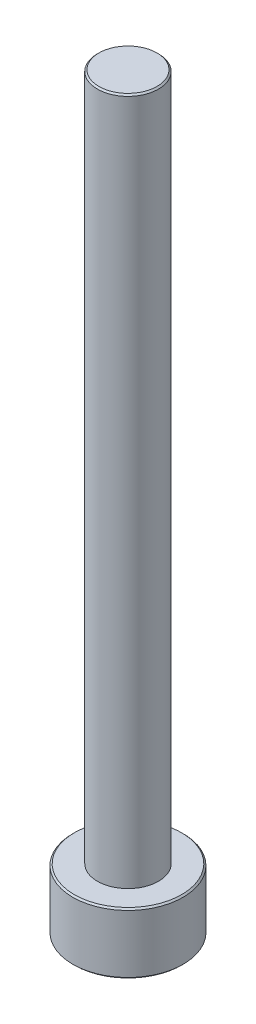
ISO-10303-21;
HEADER;
FILE_DESCRIPTION(('STEP AP214'),'2;1');
FILE_NAME('part.step','',(''),(''),'','','');
FILE_SCHEMA(('AUTOMOTIVE_DESIGN { 1 0 10303 214 1 1 1 1 }'));
ENDSEC;
DATA;
#1=APPLICATION_CONTEXT('core data for automotive mechanical design processes');
#2=APPLICATION_PROTOCOL_DEFINITION('international standard','automotive_design',2000,#1);
#3=PRODUCT_CONTEXT('',#1,'mechanical');
#4=PRODUCT('Part','Part','',(#3));
#5=PRODUCT_RELATED_PRODUCT_CATEGORY('part','',(#4));
#6=PRODUCT_DEFINITION_FORMATION('','',#4);
#7=PRODUCT_DEFINITION_CONTEXT('part definition',#1,'design');
#8=PRODUCT_DEFINITION('design','',#6,#7);
#9=PRODUCT_DEFINITION_SHAPE('','',#8);
#10=(LENGTH_UNIT() NAMED_UNIT(*) SI_UNIT(.MILLI.,.METRE.));
#11=(NAMED_UNIT(*) PLANE_ANGLE_UNIT() SI_UNIT($,.RADIAN.));
#12=(NAMED_UNIT(*) SI_UNIT($,.STERADIAN.) SOLID_ANGLE_UNIT());
#13=UNCERTAINTY_MEASURE_WITH_UNIT(LENGTH_MEASURE(1.E-05),#10,'distance_accuracy_value','');
#14=(GEOMETRIC_REPRESENTATION_CONTEXT(3) GLOBAL_UNCERTAINTY_ASSIGNED_CONTEXT((#13)) GLOBAL_UNIT_ASSIGNED_CONTEXT((#10,
#11,#12)) REPRESENTATION_CONTEXT('',''));
#15=CARTESIAN_POINT('',(0.,0.,0.));
#16=DIRECTION('',(0.,0.,1.));
#17=DIRECTION('',(1.,0.,0.));
#18=AXIS2_PLACEMENT_3D('',#15,#16,#17);
#19=CARTESIAN_POINT('',(0.,4.,0.));
#20=DIRECTION('',(0.,-1.,0.));
#21=DIRECTION('',(0.,0.,-1.));
#22=AXIS2_PLACEMENT_3D('',#19,#20,#21);
#23=CYLINDRICAL_SURFACE('',#22,3.61);
#24=CARTESIAN_POINT('',(0.,3.89999999999999,0.));
#25=DIRECTION('',(0.,1.,0.));
#26=DIRECTION('',(0.,0.,1.));
#27=AXIS2_PLACEMENT_3D('',#24,#25,#26);
#28=CIRCLE('',#27,3.61);
#29=CARTESIAN_POINT('',(0.,3.89999999999999,3.61));
#30=VERTEX_POINT('',#29);
#31=EDGE_CURVE('E55',#30,#30,#28,.F.);
#32=ORIENTED_EDGE('',*,*,#31,.T.);
#33=EDGE_LOOP('',(#32));
#34=FACE_BOUND('',#33,.T.);
#35=CARTESIAN_POINT('',(0.,0.100000000000002,0.));
#36=DIRECTION('',(0.,1.,0.));
#37=DIRECTION('',(0.,0.,1.));
#38=AXIS2_PLACEMENT_3D('',#35,#36,#37);
#39=CIRCLE('',#38,3.61);
#40=CARTESIAN_POINT('',(0.,0.100000000000002,3.61));
#41=VERTEX_POINT('',#40);
#42=EDGE_CURVE('E166',#41,#41,#39,.T.);
#43=ORIENTED_EDGE('',*,*,#42,.T.);
#44=EDGE_LOOP('',(#43));
#45=FACE_BOUND('',#44,.T.);
#46=ADVANCED_FACE('F47',(#34,#45),#23,.T.);
#47=CARTESIAN_POINT('',(0.,4.,0.));
#48=DIRECTION('',(0.,1.,0.));
#49=DIRECTION('',(0.,0.,1.));
#50=AXIS2_PLACEMENT_3D('',#47,#48,#49);
#51=PLANE('',#50);
#52=CARTESIAN_POINT('',(0.,4.,0.));
#53=DIRECTION('',(0.,1.,0.));
#54=DIRECTION('',(0.,0.,1.));
#55=AXIS2_PLACEMENT_3D('',#52,#53,#54);
#56=CIRCLE('',#55,3.50999999999999);
#57=CARTESIAN_POINT('',(0.,4.,3.50999999999999));
#58=VERTEX_POINT('',#57);
#59=EDGE_CURVE('E163',#58,#58,#56,.T.);
#60=ORIENTED_EDGE('',*,*,#59,.T.);
#61=EDGE_LOOP('',(#60));
#62=FACE_BOUND('',#61,.T.);
#63=CARTESIAN_POINT('',(0.,4.,0.));
#64=DIRECTION('',(0.,1.,0.));
#65=DIRECTION('',(0.,0.,1.));
#66=AXIS2_PLACEMENT_3D('',#63,#64,#65);
#67=CIRCLE('',#66,2.);
#68=CARTESIAN_POINT('',(0.,4.,-2.));
#69=VERTEX_POINT('',#68);
#70=EDGE_CURVE('E149',#69,#69,#67,.T.);
#71=ORIENTED_EDGE('',*,*,#70,.F.);
#72=EDGE_LOOP('',(#71));
#73=FACE_BOUND('',#72,.T.);
#74=ADVANCED_FACE('F179',(#62,#73),#51,.T.);
#75=CARTESIAN_POINT('',(0.,0.,0.));
#76=DIRECTION('',(0.,1.,0.));
#77=DIRECTION('',(0.,0.,1.));
#78=AXIS2_PLACEMENT_3D('',#75,#76,#77);
#79=PLANE('',#78);
#80=CARTESIAN_POINT('',(0.,0.,0.));
#81=DIRECTION('',(0.,1.,0.));
#82=DIRECTION('',(0.,0.,1.));
#83=AXIS2_PLACEMENT_3D('',#80,#81,#82);
#84=CIRCLE('',#83,3.51);
#85=CARTESIAN_POINT('',(0.,0.,3.51));
#86=VERTEX_POINT('',#85);
#87=EDGE_CURVE('E11',#86,#86,#84,.F.);
#88=ORIENTED_EDGE('',*,*,#87,.T.);
#89=EDGE_LOOP('',(#88));
#90=FACE_BOUND('',#89,.T.);
#91=DIRECTION('',(0.,0.,1.));
#92=VECTOR('',#91,1.);
#93=CARTESIAN_POINT('',(1.54,0.,-0.889119414552024));
#94=LINE('',#93,#92);
#95=CARTESIAN_POINT('',(1.54,0.,-0.889119414552024));
#96=VERTEX_POINT('',#95);
#97=CARTESIAN_POINT('',(1.54,0.,0.889119414552024));
#98=VERTEX_POINT('',#97);
#99=EDGE_CURVE('E136',#96,#98,#94,.T.);
#100=ORIENTED_EDGE('',*,*,#99,.F.);
#101=DIRECTION('',(0.866025403784439,0.,0.5));
#102=VECTOR('',#101,1.);
#103=CARTESIAN_POINT('',(0.,0.,-1.77823882910405));
#104=LINE('',#103,#102);
#105=CARTESIAN_POINT('',(0.,0.,-1.77823882910405));
#106=VERTEX_POINT('',#105);
#107=EDGE_CURVE('E62',#106,#96,#104,.T.);
#108=ORIENTED_EDGE('',*,*,#107,.F.);
#109=DIRECTION('',(0.866025403784439,0.,-0.5));
#110=VECTOR('',#109,1.);
#111=CARTESIAN_POINT('',(-1.54,0.,-0.889119414552024));
#112=LINE('',#111,#110);
#113=CARTESIAN_POINT('',(-1.54,0.,-0.889119414552024));
#114=VERTEX_POINT('',#113);
#115=EDGE_CURVE('E145',#114,#106,#112,.T.);
#116=ORIENTED_EDGE('',*,*,#115,.F.);
#117=DIRECTION('',(0.,0.,-1.));
#118=VECTOR('',#117,1.);
#119=CARTESIAN_POINT('',(-1.54,0.,0.889119414552024));
#120=LINE('',#119,#118);
#121=CARTESIAN_POINT('',(-1.54,0.,0.889119414552024));
#122=VERTEX_POINT('',#121);
#123=EDGE_CURVE('E143',#122,#114,#120,.T.);
#124=ORIENTED_EDGE('',*,*,#123,.F.);
#125=DIRECTION('',(-0.866025403784438,0.,-0.5));
#126=VECTOR('',#125,1.);
#127=CARTESIAN_POINT('',(0.,0.,1.77823882910405));
#128=LINE('',#127,#126);
#129=CARTESIAN_POINT('',(0.,0.,1.77823882910405));
#130=VERTEX_POINT('',#129);
#131=EDGE_CURVE('E110',#130,#122,#128,.T.);
#132=ORIENTED_EDGE('',*,*,#131,.F.);
#133=DIRECTION('',(-0.866025403784439,0.,0.5));
#134=VECTOR('',#133,1.);
#135=CARTESIAN_POINT('',(1.54,0.,0.889119414552024));
#136=LINE('',#135,#134);
#137=EDGE_CURVE('E139',#98,#130,#136,.T.);
#138=ORIENTED_EDGE('',*,*,#137,.F.);
#139=EDGE_LOOP('',(#100,#108,#116,#124,#132,#138));
#140=FACE_BOUND('',#139,.T.);
#141=ADVANCED_FACE('F182',(#90,#140),#79,.F.);
#142=CARTESIAN_POINT('',(0.,49.,0.));
#143=DIRECTION('',(0.,-1.,0.));
#144=DIRECTION('',(0.,0.,-1.));
#145=AXIS2_PLACEMENT_3D('',#142,#143,#144);
#146=CYLINDRICAL_SURFACE('',#145,2.);
#147=CARTESIAN_POINT('',(0.,48.9,0.));
#148=DIRECTION('',(0.,1.,0.));
#149=DIRECTION('',(0.,0.,1.));
#150=AXIS2_PLACEMENT_3D('',#147,#148,#149);
#151=CIRCLE('',#150,2.);
#152=CARTESIAN_POINT('',(0.,48.9,-2.));
#153=VERTEX_POINT('',#152);
#154=EDGE_CURVE('E160',#153,#153,#151,.F.);
#155=CARTESIAN_POINT('',(0.,48.9,-2.));
#156=CARTESIAN_POINT('',(0.,48.4322916666667,-2.));
#157=CARTESIAN_POINT('',(0.,47.9645833333334,-2.));
#158=CARTESIAN_POINT('',(0.,47.0291666666667,-2.));
#159=CARTESIAN_POINT('',(0.,46.5614583333334,-2.));
#160=CARTESIAN_POINT('',(0.,45.6260416666667,-2.));
#161=CARTESIAN_POINT('',(0.,45.1583333333334,-2.));
#162=CARTESIAN_POINT('',(0.,44.2229166666667,-2.));
#163=CARTESIAN_POINT('',(0.,43.7552083333333,-2.));
#164=CARTESIAN_POINT('',(0.,42.8197916666667,-2.));
#165=CARTESIAN_POINT('',(0.,42.3520833333334,-2.));
#166=CARTESIAN_POINT('',(0.,41.4166666666667,-2.));
#167=CARTESIAN_POINT('',(0.,40.9489583333334,-2.));
#168=CARTESIAN_POINT('',(0.,40.0135416666667,-2.));
#169=CARTESIAN_POINT('',(0.,39.5458333333333,-2.));
#170=CARTESIAN_POINT('',(0.,38.6104166666667,-2.));
#171=CARTESIAN_POINT('',(0.,38.1427083333334,-2.));
#172=CARTESIAN_POINT('',(0.,37.2072916666667,-2.));
#173=CARTESIAN_POINT('',(0.,36.7395833333333,-2.));
#174=CARTESIAN_POINT('',(0.,35.8041666666667,-2.));
#175=CARTESIAN_POINT('',(0.,35.3364583333333,-2.));
#176=CARTESIAN_POINT('',(0.,34.4010416666667,-2.));
#177=CARTESIAN_POINT('',(0.,33.9333333333334,-2.));
#178=CARTESIAN_POINT('',(0.,32.9979166666667,-2.));
#179=CARTESIAN_POINT('',(0.,32.5302083333333,-2.));
#180=CARTESIAN_POINT('',(0.,31.5947916666667,-2.));
#181=CARTESIAN_POINT('',(0.,31.1270833333333,-2.));
#182=CARTESIAN_POINT('',(0.,30.1916666666667,-2.));
#183=CARTESIAN_POINT('',(0.,29.7239583333333,-2.));
#184=CARTESIAN_POINT('',(0.,28.7885416666667,-2.));
#185=CARTESIAN_POINT('',(0.,28.3208333333333,-2.));
#186=CARTESIAN_POINT('',(0.,27.3854166666667,-2.));
#187=CARTESIAN_POINT('',(0.,26.9177083333333,-2.));
#188=CARTESIAN_POINT('',(0.,25.9822916666667,-2.));
#189=CARTESIAN_POINT('',(0.,25.5145833333333,-2.));
#190=CARTESIAN_POINT('',(0.,24.5791666666667,-2.));
#191=CARTESIAN_POINT('',(0.,24.1114583333333,-2.));
#192=CARTESIAN_POINT('',(0.,23.1760416666667,-2.));
#193=CARTESIAN_POINT('',(0.,22.7083333333333,-2.));
#194=CARTESIAN_POINT('',(0.,21.7729166666667,-2.));
#195=CARTESIAN_POINT('',(0.,21.3052083333333,-2.));
#196=CARTESIAN_POINT('',(0.,20.3697916666667,-2.));
#197=CARTESIAN_POINT('',(0.,19.9020833333333,-2.));
#198=CARTESIAN_POINT('',(0.,18.9666666666667,-2.));
#199=CARTESIAN_POINT('',(0.,18.4989583333333,-2.));
#200=CARTESIAN_POINT('',(0.,17.5635416666667,-2.));
#201=CARTESIAN_POINT('',(0.,17.0958333333333,-2.));
#202=CARTESIAN_POINT('',(0.,16.1604166666667,-2.));
#203=CARTESIAN_POINT('',(0.,15.6927083333333,-2.));
#204=CARTESIAN_POINT('',(0.,14.7572916666667,-2.));
#205=CARTESIAN_POINT('',(0.,14.2895833333333,-2.));
#206=CARTESIAN_POINT('',(0.,13.3541666666667,-2.));
#207=CARTESIAN_POINT('',(0.,12.8864583333333,-2.));
#208=CARTESIAN_POINT('',(0.,11.9510416666667,-2.));
#209=CARTESIAN_POINT('',(0.,11.4833333333333,-2.));
#210=CARTESIAN_POINT('',(0.,10.5479166666667,-2.));
#211=CARTESIAN_POINT('',(0.,10.0802083333333,-2.));
#212=CARTESIAN_POINT('',(0.,9.14479166666667,-2.));
#213=CARTESIAN_POINT('',(0.,8.67708333333333,-2.));
#214=CARTESIAN_POINT('',(0.,7.74166666666667,-2.));
#215=CARTESIAN_POINT('',(0.,7.27395833333333,-2.));
#216=CARTESIAN_POINT('',(0.,6.33854166666667,-2.));
#217=CARTESIAN_POINT('',(0.,5.87083333333333,-2.));
#218=CARTESIAN_POINT('',(0.,4.93541666666666,-2.));
#219=CARTESIAN_POINT('',(0.,4.46770833333333,-2.));
#220=CARTESIAN_POINT('',(0.,4.,-2.));
#221=B_SPLINE_CURVE_WITH_KNOTS('',3,(#155,#156,#157,#158,#159,#160,#161,#162,#163,#164,#165,
#166,#167,#168,#169,#170,#171,#172,#173,#174,#175,#176,#177,#178,#179,#180,#181,#182,#183,#184,
#185,#186,#187,#188,#189,#190,#191,#192,#193,#194,#195,#196,#197,#198,#199,#200,#201,#202,#203,
#204,#205,#206,#207,#208,#209,#210,#211,#212,#213,#214,#215,#216,#217,#218,#219,#220),
.UNSPECIFIED.,.F.,.F.,(4,2,2,2,2,2,2,2,2,2,2,2,2,2,2,2,2,2,2,2,2,2,2,2,2,2,2,2,2,2,2,2,4),(0.,
1.403125,2.80625,4.209375,5.6125,7.015625,8.41875,9.821875,11.225,12.628125,14.03125,15.434375,
16.8375,18.240625,19.64375,21.046875,22.45,23.853125,25.25625,26.659375,28.0625,29.465625,
30.86875,32.271875,33.675,35.078125,36.48125,37.884375,39.2875,40.690625,42.09375,43.496875,
44.9),.UNSPECIFIED.);
#222=EDGE_CURVE('BSEAM186',#153,#69,#221,.T.);
#223=ORIENTED_EDGE('',*,*,#154,.T.);
#224=ORIENTED_EDGE('',*,*,#70,.T.);
#225=ORIENTED_EDGE('',*,*,#222,.T.);
#226=ORIENTED_EDGE('',*,*,#222,.F.);
#227=EDGE_LOOP('',(#223,#225,#224,#226));
#228=FACE_BOUND('',#227,.T.);
#229=ADVANCED_FACE('F186',(#228),#146,.T.);
#230=CARTESIAN_POINT('',(0.,49.,0.));
#231=DIRECTION('',(0.,1.,0.));
#232=DIRECTION('',(0.,0.,1.));
#233=AXIS2_PLACEMENT_3D('',#230,#231,#232);
#234=PLANE('',#233);
#235=CARTESIAN_POINT('',(0.,49.,0.));
#236=DIRECTION('',(0.,1.,0.));
#237=DIRECTION('',(0.,0.,1.));
#238=AXIS2_PLACEMENT_3D('',#235,#236,#237);
#239=CIRCLE('',#238,1.90000000000003);
#240=CARTESIAN_POINT('',(0.,49.,-1.90000000000003));
#241=VERTEX_POINT('',#240);
#242=EDGE_CURVE('E157',#241,#241,#239,.T.);
#243=ORIENTED_EDGE('',*,*,#242,.T.);
#244=EDGE_LOOP('',(#243));
#245=FACE_BOUND('',#244,.T.);
#246=ADVANCED_FACE('F188',(#245),#234,.T.);
#247=CARTESIAN_POINT('',(0.,2.,-1.77823882910405));
#248=DIRECTION('',(0.5,0.,-0.866025403784439));
#249=DIRECTION('',(-0.866025403784439,0.,-0.5));
#250=AXIS2_PLACEMENT_3D('',#247,#248,#249);
#251=PLANE('',#250);
#252=ORIENTED_EDGE('',*,*,#107,.T.);
#253=DIRECTION('',(0.,-1.,0.));
#254=VECTOR('',#253,1.);
#255=CARTESIAN_POINT('',(1.54,2.,-0.889119414552024));
#256=LINE('',#255,#254);
#257=CARTESIAN_POINT('',(1.54,2.,-0.889119414552024));
#258=VERTEX_POINT('',#257);
#259=EDGE_CURVE('E92',#258,#96,#256,.T.);
#260=ORIENTED_EDGE('',*,*,#259,.F.);
#261=DIRECTION('',(0.866025403784439,0.,0.5));
#262=VECTOR('',#261,1.);
#263=CARTESIAN_POINT('',(0.,2.,-1.77823882910405));
#264=LINE('',#263,#262);
#265=CARTESIAN_POINT('',(0.,2.,-1.77823882910405));
#266=VERTEX_POINT('',#265);
#267=EDGE_CURVE('E147',#266,#258,#264,.T.);
#268=ORIENTED_EDGE('',*,*,#267,.F.);
#269=DIRECTION('',(0.,-1.,0.));
#270=VECTOR('',#269,1.);
#271=CARTESIAN_POINT('',(0.,2.,-1.77823882910405));
#272=LINE('',#271,#270);
#273=EDGE_CURVE('E70',#266,#106,#272,.T.);
#274=ORIENTED_EDGE('',*,*,#273,.T.);
#275=EDGE_LOOP('',(#252,#260,#268,#274));
#276=FACE_BOUND('',#275,.T.);
#277=ADVANCED_FACE('F194',(#276),#251,.F.);
#278=CARTESIAN_POINT('',(-1.54,2.,-0.889119414552024));
#279=DIRECTION('',(-0.5,0.,-0.866025403784439));
#280=DIRECTION('',(-0.866025403784439,0.,0.5));
#281=AXIS2_PLACEMENT_3D('',#278,#279,#280);
#282=PLANE('',#281);
#283=ORIENTED_EDGE('',*,*,#115,.T.);
#284=ORIENTED_EDGE('',*,*,#273,.F.);
#285=DIRECTION('',(0.866025403784439,0.,-0.5));
#286=VECTOR('',#285,1.);
#287=CARTESIAN_POINT('',(-1.54,2.,-0.889119414552024));
#288=LINE('',#287,#286);
#289=CARTESIAN_POINT('',(-1.54,2.,-0.889119414552024));
#290=VERTEX_POINT('',#289);
#291=EDGE_CURVE('E122',#290,#266,#288,.T.);
#292=ORIENTED_EDGE('',*,*,#291,.F.);
#293=DIRECTION('',(0.,-1.,0.));
#294=VECTOR('',#293,1.);
#295=CARTESIAN_POINT('',(-1.54,2.,-0.889119414552024));
#296=LINE('',#295,#294);
#297=EDGE_CURVE('E114',#290,#114,#296,.T.);
#298=ORIENTED_EDGE('',*,*,#297,.T.);
#299=EDGE_LOOP('',(#283,#284,#292,#298));
#300=FACE_BOUND('',#299,.T.);
#301=ADVANCED_FACE('F222',(#300),#282,.F.);
#302=CARTESIAN_POINT('',(-1.54,2.,0.889119414552024));
#303=DIRECTION('',(-1.,0.,0.));
#304=DIRECTION('',(0.,0.,1.));
#305=AXIS2_PLACEMENT_3D('',#302,#303,#304);
#306=PLANE('',#305);
#307=ORIENTED_EDGE('',*,*,#123,.T.);
#308=ORIENTED_EDGE('',*,*,#297,.F.);
#309=DIRECTION('',(0.,0.,-1.));
#310=VECTOR('',#309,1.);
#311=CARTESIAN_POINT('',(-1.54,2.,0.889119414552024));
#312=LINE('',#311,#310);
#313=CARTESIAN_POINT('',(-1.54,2.,0.889119414552024));
#314=VERTEX_POINT('',#313);
#315=EDGE_CURVE('E118',#314,#290,#312,.T.);
#316=ORIENTED_EDGE('',*,*,#315,.F.);
#317=DIRECTION('',(0.,-1.,0.));
#318=VECTOR('',#317,1.);
#319=CARTESIAN_POINT('',(-1.54,2.,0.889119414552024));
#320=LINE('',#319,#318);
#321=EDGE_CURVE('E103',#314,#122,#320,.T.);
#322=ORIENTED_EDGE('',*,*,#321,.T.);
#323=EDGE_LOOP('',(#307,#308,#316,#322));
#324=FACE_BOUND('',#323,.T.);
#325=ADVANCED_FACE('F119',(#324),#306,.F.);
#326=CARTESIAN_POINT('',(0.,2.,1.77823882910405));
#327=DIRECTION('',(-0.5,0.,0.866025403784439));
#328=DIRECTION('',(0.866025403784438,0.,0.5));
#329=AXIS2_PLACEMENT_3D('',#326,#327,#328);
#330=PLANE('',#329);
#331=ORIENTED_EDGE('',*,*,#131,.T.);
#332=ORIENTED_EDGE('',*,*,#321,.F.);
#333=DIRECTION('',(-0.866025403784438,0.,-0.5));
#334=VECTOR('',#333,1.);
#335=CARTESIAN_POINT('',(0.,2.,1.77823882910405));
#336=LINE('',#335,#334);
#337=CARTESIAN_POINT('',(0.,2.,1.77823882910405));
#338=VERTEX_POINT('',#337);
#339=EDGE_CURVE('E107',#338,#314,#336,.T.);
#340=ORIENTED_EDGE('',*,*,#339,.F.);
#341=DIRECTION('',(0.,-1.,0.));
#342=VECTOR('',#341,1.);
#343=CARTESIAN_POINT('',(0.,2.,1.77823882910405));
#344=LINE('',#343,#342);
#345=EDGE_CURVE('E115',#338,#130,#344,.T.);
#346=ORIENTED_EDGE('',*,*,#345,.T.);
#347=EDGE_LOOP('',(#331,#332,#340,#346));
#348=FACE_BOUND('',#347,.T.);
#349=ADVANCED_FACE('F105',(#348),#330,.F.);
#350=CARTESIAN_POINT('',(1.54,2.,0.889119414552024));
#351=DIRECTION('',(0.5,0.,0.866025403784439));
#352=DIRECTION('',(0.866025403784439,0.,-0.5));
#353=AXIS2_PLACEMENT_3D('',#350,#351,#352);
#354=PLANE('',#353);
#355=ORIENTED_EDGE('',*,*,#137,.T.);
#356=ORIENTED_EDGE('',*,*,#345,.F.);
#357=DIRECTION('',(-0.866025403784439,0.,0.5));
#358=VECTOR('',#357,1.);
#359=CARTESIAN_POINT('',(1.54,2.,0.889119414552024));
#360=LINE('',#359,#358);
#361=CARTESIAN_POINT('',(1.54,2.,0.889119414552024));
#362=VERTEX_POINT('',#361);
#363=EDGE_CURVE('E128',#362,#338,#360,.T.);
#364=ORIENTED_EDGE('',*,*,#363,.F.);
#365=DIRECTION('',(0.,-1.,0.));
#366=VECTOR('',#365,1.);
#367=CARTESIAN_POINT('',(1.54,2.,0.889119414552024));
#368=LINE('',#367,#366);
#369=EDGE_CURVE('E152',#362,#98,#368,.T.);
#370=ORIENTED_EDGE('',*,*,#369,.T.);
#371=EDGE_LOOP('',(#355,#356,#364,#370));
#372=FACE_BOUND('',#371,.T.);
#373=ADVANCED_FACE('F218',(#372),#354,.F.);
#374=CARTESIAN_POINT('',(1.54,2.,-0.889119414552024));
#375=DIRECTION('',(1.,0.,0.));
#376=DIRECTION('',(0.,0.,-1.));
#377=AXIS2_PLACEMENT_3D('',#374,#375,#376);
#378=PLANE('',#377);
#379=ORIENTED_EDGE('',*,*,#99,.T.);
#380=ORIENTED_EDGE('',*,*,#369,.F.);
#381=DIRECTION('',(0.,0.,1.));
#382=VECTOR('',#381,1.);
#383=CARTESIAN_POINT('',(1.54,2.,-0.889119414552024));
#384=LINE('',#383,#382);
#385=EDGE_CURVE('E130',#258,#362,#384,.T.);
#386=ORIENTED_EDGE('',*,*,#385,.F.);
#387=ORIENTED_EDGE('',*,*,#259,.T.);
#388=EDGE_LOOP('',(#379,#380,#386,#387));
#389=FACE_BOUND('',#388,.T.);
#390=ADVANCED_FACE('F210',(#389),#378,.F.);
#391=CARTESIAN_POINT('',(0.,2.,0.));
#392=DIRECTION('',(0.,-1.,0.));
#393=DIRECTION('',(0.,0.,-1.));
#394=AXIS2_PLACEMENT_3D('',#391,#392,#393);
#395=PLANE('',#394);
#396=ORIENTED_EDGE('',*,*,#267,.T.);
#397=ORIENTED_EDGE('',*,*,#385,.T.);
#398=ORIENTED_EDGE('',*,*,#363,.T.);
#399=ORIENTED_EDGE('',*,*,#339,.T.);
#400=ORIENTED_EDGE('',*,*,#315,.T.);
#401=ORIENTED_EDGE('',*,*,#291,.T.);
#402=EDGE_LOOP('',(#396,#397,#398,#399,#400,#401));
#403=FACE_BOUND('',#402,.T.);
#404=ADVANCED_FACE('F125',(#403),#395,.T.);
#405=CARTESIAN_POINT('',(0.,49.,0.));
#406=DIRECTION('',(0.,-1.,0.));
#407=DIRECTION('',(0.,0.,-1.));
#408=AXIS2_PLACEMENT_3D('',#405,#406,#407);
#409=CONICAL_SURFACE('',#408,1.90000000000003,0.785398163397442);
#410=CARTESIAN_POINT('',(0.,48.9,-2.));
#411=CARTESIAN_POINT('',(0.,48.9010416666667,-1.99895833333334));
#412=CARTESIAN_POINT('',(0.,48.9020833333334,-1.99791666666667));
#413=CARTESIAN_POINT('',(0.,48.9041666666667,-1.99583333333334));
#414=CARTESIAN_POINT('',(0.,48.9052083333334,-1.99479166666667));
#415=CARTESIAN_POINT('',(0.,48.9072916666667,-1.99270833333334));
#416=CARTESIAN_POINT('',(0.,48.9083333333334,-1.99166666666667));
#417=CARTESIAN_POINT('',(0.,48.9104166666667,-1.98958333333334));
#418=CARTESIAN_POINT('',(0.,48.9114583333333,-1.98854166666667));
#419=CARTESIAN_POINT('',(0.,48.9135416666667,-1.98645833333334));
#420=CARTESIAN_POINT('',(0.,48.9145833333334,-1.98541666666667));
#421=CARTESIAN_POINT('',(0.,48.9166666666667,-1.98333333333334));
#422=CARTESIAN_POINT('',(0.,48.9177083333334,-1.98229166666668));
#423=CARTESIAN_POINT('',(0.,48.9197916666667,-1.98020833333334));
#424=CARTESIAN_POINT('',(0.,48.9208333333333,-1.97916666666668));
#425=CARTESIAN_POINT('',(0.,48.9229166666667,-1.97708333333334));
#426=CARTESIAN_POINT('',(0.,48.9239583333334,-1.97604166666668));
#427=CARTESIAN_POINT('',(0.,48.9260416666667,-1.97395833333334));
#428=CARTESIAN_POINT('',(0.,48.9270833333333,-1.97291666666668));
#429=CARTESIAN_POINT('',(0.,48.9291666666667,-1.97083333333334));
#430=CARTESIAN_POINT('',(0.,48.9302083333333,-1.96979166666668));
#431=CARTESIAN_POINT('',(0.,48.9322916666667,-1.96770833333335));
#432=CARTESIAN_POINT('',(0.,48.9333333333334,-1.96666666666668));
#433=CARTESIAN_POINT('',(0.,48.9354166666667,-1.96458333333335));
#434=CARTESIAN_POINT('',(0.,48.9364583333333,-1.96354166666668));
#435=CARTESIAN_POINT('',(0.,48.9385416666667,-1.96145833333335));
#436=CARTESIAN_POINT('',(0.,48.9395833333333,-1.96041666666668));
#437=CARTESIAN_POINT('',(0.,48.9416666666667,-1.95833333333335));
#438=CARTESIAN_POINT('',(0.,48.9427083333333,-1.95729166666668));
#439=CARTESIAN_POINT('',(0.,48.9447916666667,-1.95520833333335));
#440=CARTESIAN_POINT('',(0.,48.9458333333333,-1.95416666666668));
#441=CARTESIAN_POINT('',(0.,48.9479166666667,-1.95208333333335));
#442=CARTESIAN_POINT('',(0.,48.9489583333333,-1.95104166666668));
#443=CARTESIAN_POINT('',(0.,48.9510416666667,-1.94895833333335));
#444=CARTESIAN_POINT('',(0.,48.9520833333333,-1.94791666666668));
#445=CARTESIAN_POINT('',(0.,48.9541666666667,-1.94583333333335));
#446=CARTESIAN_POINT('',(0.,48.9552083333333,-1.94479166666668));
#447=CARTESIAN_POINT('',(0.,48.9572916666667,-1.94270833333335));
#448=CARTESIAN_POINT('',(0.,48.9583333333333,-1.94166666666669));
#449=CARTESIAN_POINT('',(0.,48.9604166666667,-1.93958333333335));
#450=CARTESIAN_POINT('',(0.,48.9614583333333,-1.93854166666669));
#451=CARTESIAN_POINT('',(0.,48.9635416666667,-1.93645833333335));
#452=CARTESIAN_POINT('',(0.,48.9645833333333,-1.93541666666669));
#453=CARTESIAN_POINT('',(0.,48.9666666666667,-1.93333333333335));
#454=CARTESIAN_POINT('',(0.,48.9677083333333,-1.93229166666669));
#455=CARTESIAN_POINT('',(0.,48.9697916666667,-1.93020833333336));
#456=CARTESIAN_POINT('',(0.,48.9708333333333,-1.92916666666669));
#457=CARTESIAN_POINT('',(0.,48.9729166666667,-1.92708333333336));
#458=CARTESIAN_POINT('',(0.,48.9739583333333,-1.92604166666669));
#459=CARTESIAN_POINT('',(0.,48.9760416666667,-1.92395833333336));
#460=CARTESIAN_POINT('',(0.,48.9770833333333,-1.92291666666669));
#461=CARTESIAN_POINT('',(0.,48.9791666666667,-1.92083333333336));
#462=CARTESIAN_POINT('',(0.,48.9802083333333,-1.91979166666669));
#463=CARTESIAN_POINT('',(0.,48.9822916666667,-1.91770833333336));
#464=CARTESIAN_POINT('',(0.,48.9833333333333,-1.91666666666669));
#465=CARTESIAN_POINT('',(0.,48.9854166666667,-1.91458333333336));
#466=CARTESIAN_POINT('',(0.,48.9864583333333,-1.91354166666669));
#467=CARTESIAN_POINT('',(0.,48.9885416666667,-1.91145833333336));
#468=CARTESIAN_POINT('',(0.,48.9895833333333,-1.91041666666669));
#469=CARTESIAN_POINT('',(0.,48.9916666666667,-1.90833333333336));
#470=CARTESIAN_POINT('',(0.,48.9927083333333,-1.90729166666669));
#471=CARTESIAN_POINT('',(0.,48.9947916666667,-1.90520833333336));
#472=CARTESIAN_POINT('',(0.,48.9958333333333,-1.9041666666667));
#473=CARTESIAN_POINT('',(0.,48.9979166666667,-1.90208333333336));
#474=CARTESIAN_POINT('',(0.,48.9989583333333,-1.9010416666667));
#475=CARTESIAN_POINT('',(0.,49.,-1.90000000000003));
#476=B_SPLINE_CURVE_WITH_KNOTS('',3,(#410,#411,#412,#413,#414,#415,#416,#417,#418,#419,#420,
#421,#422,#423,#424,#425,#426,#427,#428,#429,#430,#431,#432,#433,#434,#435,#436,#437,#438,#439,
#440,#441,#442,#443,#444,#445,#446,#447,#448,#449,#450,#451,#452,#453,#454,#455,#456,#457,#458,
#459,#460,#461,#462,#463,#464,#465,#466,#467,#468,#469,#470,#471,#472,#473,#474,#475),
.UNSPECIFIED.,.F.,.F.,(4,2,2,2,2,2,2,2,2,2,2,2,2,2,2,2,2,2,2,2,2,2,2,2,2,2,2,2,2,2,2,2,4),(0.,
0.00441941738241513,0.00883883476483026,0.0132582521472454,0.0176776695296605,
0.0220970869120753,0.0265165042944905,0.0309359216769056,0.0353553390593207,0.0397747564417359,
0.044194173824151,0.0486135912065661,0.0530330085889812,0.0574524259713964,0.0618718433538115,
0.0662912607362266,0.0707106781186367,0.0751300955010518,0.079549512883467,0.0839689302658819,
0.0883883476482971,0.0928077650307122,0.0972271824131273,0.101646599795542,0.106066017177958,
0.110485434560373,0.114904851942788,0.119324269325203,0.123743686707618,0.128163104090033,
0.132582521472448,0.137001938854863,0.141421356237278),.UNSPECIFIED.);
#477=EDGE_CURVE('BSEAM176',#153,#241,#476,.T.);
#478=ORIENTED_EDGE('',*,*,#154,.F.);
#479=ORIENTED_EDGE('',*,*,#242,.F.);
#480=ORIENTED_EDGE('',*,*,#477,.T.);
#481=ORIENTED_EDGE('',*,*,#477,.F.);
#482=EDGE_LOOP('',(#478,#480,#479,#481));
#483=FACE_BOUND('',#482,.T.);
#484=ADVANCED_FACE('F176',(#483),#409,.T.);
#485=CARTESIAN_POINT('',(0.,4.,0.));
#486=DIRECTION('',(0.,-1.,0.));
#487=DIRECTION('',(0.,0.,-1.));
#488=AXIS2_PLACEMENT_3D('',#485,#486,#487);
#489=CONICAL_SURFACE('',#488,3.50999999999999,0.785398163397422);
#490=ORIENTED_EDGE('',*,*,#31,.F.);
#491=EDGE_LOOP('',(#490));
#492=FACE_BOUND('',#491,.T.);
#493=ORIENTED_EDGE('',*,*,#59,.F.);
#494=EDGE_LOOP('',(#493));
#495=FACE_BOUND('',#494,.T.);
#496=ADVANCED_FACE('F173',(#492,#495),#489,.T.);
#497=CARTESIAN_POINT('',(0.,0.100000000000002,0.));
#498=DIRECTION('',(0.,1.,0.));
#499=DIRECTION('',(0.,0.,1.));
#500=AXIS2_PLACEMENT_3D('',#497,#498,#499);
#501=CONICAL_SURFACE('',#500,3.61,0.785398163397442);
#502=ORIENTED_EDGE('',*,*,#87,.F.);
#503=EDGE_LOOP('',(#502));
#504=FACE_BOUND('',#503,.T.);
#505=ORIENTED_EDGE('',*,*,#42,.F.);
#506=EDGE_LOOP('',(#505));
#507=FACE_BOUND('',#506,.T.);
#508=ADVANCED_FACE('F49',(#504,#507),#501,.T.);
#509=CLOSED_SHELL('',(#46,#74,#141,#229,#246,#277,#301,#325,#349,#373,#390,#404,#484,#496,#508));
#510=MANIFOLD_SOLID_BREP('B2',#509);
#511=ADVANCED_BREP_SHAPE_REPRESENTATION('',(#18,#510),#14);
#512=SHAPE_DEFINITION_REPRESENTATION(#9,#511);
ENDSEC;
END-ISO-10303-21;
